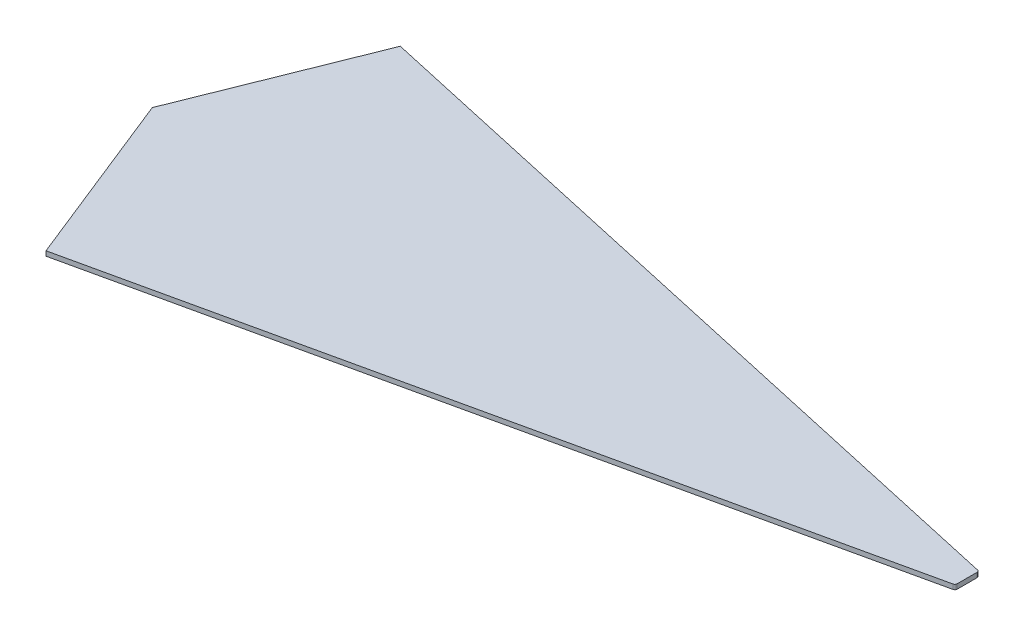
ISO-10303-21;
HEADER;
FILE_DESCRIPTION(('STEP AP214'),'2;1');
FILE_NAME('part.step','',(''),(''),'','','');
FILE_SCHEMA(('AUTOMOTIVE_DESIGN { 1 0 10303 214 1 1 1 1 }'));
ENDSEC;
DATA;
#1=APPLICATION_CONTEXT('core data for automotive mechanical design processes');
#2=APPLICATION_PROTOCOL_DEFINITION('international standard','automotive_design',2000,#1);
#3=PRODUCT_CONTEXT('',#1,'mechanical');
#4=PRODUCT('Part','Part','',(#3));
#5=PRODUCT_RELATED_PRODUCT_CATEGORY('part','',(#4));
#6=PRODUCT_DEFINITION_FORMATION('','',#4);
#7=PRODUCT_DEFINITION_CONTEXT('part definition',#1,'design');
#8=PRODUCT_DEFINITION('design','',#6,#7);
#9=PRODUCT_DEFINITION_SHAPE('','',#8);
#10=(LENGTH_UNIT() NAMED_UNIT(*) SI_UNIT(.MILLI.,.METRE.));
#11=(NAMED_UNIT(*) PLANE_ANGLE_UNIT() SI_UNIT($,.RADIAN.));
#12=(NAMED_UNIT(*) SI_UNIT($,.STERADIAN.) SOLID_ANGLE_UNIT());
#13=UNCERTAINTY_MEASURE_WITH_UNIT(LENGTH_MEASURE(1.E-05),#10,'distance_accuracy_value','');
#14=(GEOMETRIC_REPRESENTATION_CONTEXT(3) GLOBAL_UNCERTAINTY_ASSIGNED_CONTEXT((#13)) GLOBAL_UNIT_ASSIGNED_CONTEXT((#10,
#11,#12)) REPRESENTATION_CONTEXT('',''));
#15=CARTESIAN_POINT('',(0.,0.,0.));
#16=DIRECTION('',(0.,0.,1.));
#17=DIRECTION('',(1.,0.,0.));
#18=AXIS2_PLACEMENT_3D('',#15,#16,#17);
#19=CARTESIAN_POINT('',(31.4,0.2,-0.419782839363801));
#20=DIRECTION('',(0.,1.,0.));
#21=DIRECTION('',(0.,0.,1.));
#22=AXIS2_PLACEMENT_3D('',#19,#20,#21);
#23=CYLINDRICAL_SURFACE('',#22,0.1);
#24=DIRECTION('',(0.,1.,0.));
#25=VECTOR('',#24,1.);
#26=CARTESIAN_POINT('',(31.5,0.2,-0.419782839363801));
#27=LINE('',#26,#25);
#28=CARTESIAN_POINT('',(31.5,0.,-0.419782839363802));
#29=VERTEX_POINT('',#28);
#30=CARTESIAN_POINT('',(31.5,0.2,-0.419782839363802));
#31=VERTEX_POINT('',#30);
#32=EDGE_CURVE('E128',#29,#31,#27,.T.);
#33=ORIENTED_EDGE('',*,*,#32,.F.);
#34=CARTESIAN_POINT('',(31.4,0.,-0.419782839363801));
#35=DIRECTION('',(0.,1.,0.));
#36=DIRECTION('',(0.,0.,1.));
#37=AXIS2_PLACEMENT_3D('',#34,#35,#36);
#38=CIRCLE('',#37,0.1);
#39=CARTESIAN_POINT('',(31.4216930457823,0.,-0.517401545382093));
#40=VERTEX_POINT('',#39);
#41=EDGE_CURVE('E40',#40,#29,#38,.F.);
#42=ORIENTED_EDGE('',*,*,#41,.F.);
#43=DIRECTION('',(0.,1.,0.));
#44=VECTOR('',#43,1.);
#45=CARTESIAN_POINT('',(31.4216930457823,0.2,-0.517401545382094));
#46=LINE('',#45,#44);
#47=CARTESIAN_POINT('',(31.4216930457823,0.2,-0.517401545382093));
#48=VERTEX_POINT('',#47);
#49=EDGE_CURVE('E131',#48,#40,#46,.F.);
#50=ORIENTED_EDGE('',*,*,#49,.F.);
#51=CARTESIAN_POINT('',(31.4,0.2,-0.419782839363801));
#52=DIRECTION('',(0.,1.,0.));
#53=DIRECTION('',(0.,0.,1.));
#54=AXIS2_PLACEMENT_3D('',#51,#52,#53);
#55=CIRCLE('',#54,0.1);
#56=EDGE_CURVE('E11',#31,#48,#55,.T.);
#57=ORIENTED_EDGE('',*,*,#56,.F.);
#58=EDGE_LOOP('',(#33,#42,#50,#57));
#59=FACE_BOUND('',#58,.T.);
#60=ADVANCED_FACE('F33',(#59),#23,.T.);
#61=CARTESIAN_POINT('',(31.4,0.2,0.419782839363802));
#62=DIRECTION('',(0.,-1.,0.));
#63=DIRECTION('',(0.,0.,-1.));
#64=AXIS2_PLACEMENT_3D('',#61,#62,#63);
#65=CYLINDRICAL_SURFACE('',#64,0.1);
#66=DIRECTION('',(0.,1.,0.));
#67=VECTOR('',#66,1.);
#68=CARTESIAN_POINT('',(31.4216930457823,0.2,0.517401545382095));
#69=LINE('',#68,#67);
#70=CARTESIAN_POINT('',(31.4216930457823,0.,0.517401545382093));
#71=VERTEX_POINT('',#70);
#72=CARTESIAN_POINT('',(31.4216930457823,0.2,0.517401545382093));
#73=VERTEX_POINT('',#72);
#74=EDGE_CURVE('E98',#71,#73,#69,.T.);
#75=ORIENTED_EDGE('',*,*,#74,.F.);
#76=CARTESIAN_POINT('',(31.4,0.,0.419782839363802));
#77=DIRECTION('',(0.,1.,0.));
#78=DIRECTION('',(0.,0.,1.));
#79=AXIS2_PLACEMENT_3D('',#76,#77,#78);
#80=CIRCLE('',#79,0.1);
#81=CARTESIAN_POINT('',(31.5,0.,0.419782839363802));
#82=VERTEX_POINT('',#81);
#83=EDGE_CURVE('E124',#82,#71,#80,.F.);
#84=ORIENTED_EDGE('',*,*,#83,.F.);
#85=DIRECTION('',(0.,1.,0.));
#86=VECTOR('',#85,1.);
#87=CARTESIAN_POINT('',(31.5,0.2,0.419782839363802));
#88=LINE('',#87,#86);
#89=CARTESIAN_POINT('',(31.5,0.2,0.419782839363802));
#90=VERTEX_POINT('',#89);
#91=EDGE_CURVE('E116',#90,#82,#88,.F.);
#92=ORIENTED_EDGE('',*,*,#91,.F.);
#93=CARTESIAN_POINT('',(31.4,0.2,0.419782839363802));
#94=DIRECTION('',(0.,1.,0.));
#95=DIRECTION('',(0.,0.,1.));
#96=AXIS2_PLACEMENT_3D('',#93,#94,#95);
#97=CIRCLE('',#96,0.1);
#98=EDGE_CURVE('E126',#73,#90,#97,.T.);
#99=ORIENTED_EDGE('',*,*,#98,.F.);
#100=EDGE_LOOP('',(#75,#84,#92,#99));
#101=FACE_BOUND('',#100,.T.);
#102=ADVANCED_FACE('F157',(#101),#65,.T.);
#103=CARTESIAN_POINT('',(-3.,0.2,0.));
#104=DIRECTION('',(0.928476690855301,0.,-0.371390676429));
#105=DIRECTION('',(-0.371390676429,0.,-0.928476690855301));
#106=AXIS2_PLACEMENT_3D('',#103,#104,#105);
#107=PLANE('',#106);
#108=DIRECTION('',(0.371390676429,0.,0.928476690855301));
#109=VECTOR('',#108,1.);
#110=CARTESIAN_POINT('',(-3.,0.,0.));
#111=LINE('',#110,#109);
#112=CARTESIAN_POINT('',(-3.,0.,0.));
#113=VERTEX_POINT('',#112);
#114=CARTESIAN_POINT('',(7.01790739823793E-10,0.,7.5));
#115=VERTEX_POINT('',#114);
#116=EDGE_CURVE('E113',#113,#115,#111,.T.);
#117=ORIENTED_EDGE('',*,*,#116,.T.);
#118=DIRECTION('',(0.,-1.,0.));
#119=VECTOR('',#118,1.);
#120=CARTESIAN_POINT('',(7.01790739823793E-10,0.2,7.5));
#121=LINE('',#120,#119);
#122=CARTESIAN_POINT('',(7.01790739823793E-10,0.2,7.5));
#123=VERTEX_POINT('',#122);
#124=EDGE_CURVE('E95',#123,#115,#121,.T.);
#125=ORIENTED_EDGE('',*,*,#124,.F.);
#126=DIRECTION('',(0.371390676429,0.,0.928476690855301));
#127=VECTOR('',#126,1.);
#128=CARTESIAN_POINT('',(-3.,0.2,0.));
#129=LINE('',#128,#127);
#130=CARTESIAN_POINT('',(-3.,0.2,0.));
#131=VERTEX_POINT('',#130);
#132=EDGE_CURVE('E101',#131,#123,#129,.T.);
#133=ORIENTED_EDGE('',*,*,#132,.F.);
#134=DIRECTION('',(0.,-1.,0.));
#135=VECTOR('',#134,1.);
#136=CARTESIAN_POINT('',(-3.,0.2,0.));
#137=LINE('',#136,#135);
#138=EDGE_CURVE('E118',#131,#113,#137,.T.);
#139=ORIENTED_EDGE('',*,*,#138,.T.);
#140=EDGE_LOOP('',(#117,#125,#133,#139));
#141=FACE_BOUND('',#140,.T.);
#142=ADVANCED_FACE('F111',(#141),#107,.F.);
#143=CARTESIAN_POINT('',(7.01790739823793E-10,0.2,7.5));
#144=DIRECTION('',(-0.216930457823262,0.,-0.976187060182929));
#145=DIRECTION('',(-0.976187060182929,0.,0.216930457823262));
#146=AXIS2_PLACEMENT_3D('',#143,#144,#145);
#147=PLANE('',#146);
#148=DIRECTION('',(0.976187060182929,0.,-0.216930457823262));
#149=VECTOR('',#148,1.);
#150=CARTESIAN_POINT('',(7.01790739823793E-10,0.,7.5));
#151=LINE('',#150,#149);
#152=EDGE_CURVE('E144',#115,#71,#151,.T.);
#153=ORIENTED_EDGE('',*,*,#152,.T.);
#154=ORIENTED_EDGE('',*,*,#74,.T.);
#155=DIRECTION('',(0.976187060182929,0.,-0.216930457823262));
#156=VECTOR('',#155,1.);
#157=CARTESIAN_POINT('',(7.01790739823793E-10,0.2,7.5));
#158=LINE('',#157,#156);
#159=EDGE_CURVE('E90',#123,#73,#158,.T.);
#160=ORIENTED_EDGE('',*,*,#159,.F.);
#161=ORIENTED_EDGE('',*,*,#124,.T.);
#162=EDGE_LOOP('',(#153,#154,#160,#161));
#163=FACE_BOUND('',#162,.T.);
#164=ADVANCED_FACE('F93',(#163),#147,.F.);
#165=CARTESIAN_POINT('',(31.5,0.2,-0.5));
#166=DIRECTION('',(1.,0.,0.));
#167=DIRECTION('',(0.,0.,-1.));
#168=AXIS2_PLACEMENT_3D('',#165,#166,#167);
#169=PLANE('',#168);
#170=DIRECTION('',(0.,0.,1.));
#171=VECTOR('',#170,1.);
#172=CARTESIAN_POINT('',(31.5,0.,-0.5));
#173=LINE('',#172,#171);
#174=EDGE_CURVE('E136',#29,#82,#173,.T.);
#175=ORIENTED_EDGE('',*,*,#174,.F.);
#176=ORIENTED_EDGE('',*,*,#32,.T.);
#177=DIRECTION('',(0.,0.,1.));
#178=VECTOR('',#177,1.);
#179=CARTESIAN_POINT('',(31.5,0.2,-0.5));
#180=LINE('',#179,#178);
#181=EDGE_CURVE('E100',#31,#90,#180,.T.);
#182=ORIENTED_EDGE('',*,*,#181,.T.);
#183=ORIENTED_EDGE('',*,*,#91,.T.);
#184=EDGE_LOOP('',(#175,#176,#182,#183));
#185=FACE_BOUND('',#184,.T.);
#186=ADVANCED_FACE('F142',(#185),#169,.T.);
#187=CARTESIAN_POINT('',(7.01786147398297E-10,0.2,-7.5));
#188=DIRECTION('',(0.216930457823262,0.,-0.976187060182929));
#189=DIRECTION('',(-0.976187060182929,0.,-0.216930457823262));
#190=AXIS2_PLACEMENT_3D('',#187,#188,#189);
#191=PLANE('',#190);
#192=DIRECTION('',(0.976187060182929,0.,0.216930457823262));
#193=VECTOR('',#192,1.);
#194=CARTESIAN_POINT('',(7.01786147398297E-10,0.2,-7.5));
#195=LINE('',#194,#193);
#196=CARTESIAN_POINT('',(7.01786147398297E-10,0.2,-7.5));
#197=VERTEX_POINT('',#196);
#198=EDGE_CURVE('E150',#197,#48,#195,.T.);
#199=ORIENTED_EDGE('',*,*,#198,.T.);
#200=ORIENTED_EDGE('',*,*,#49,.T.);
#201=DIRECTION('',(0.976187060182929,0.,0.216930457823262));
#202=VECTOR('',#201,1.);
#203=CARTESIAN_POINT('',(7.01786147398297E-10,0.,-7.5));
#204=LINE('',#203,#202);
#205=CARTESIAN_POINT('',(7.01786147398297E-10,0.,-7.5));
#206=VERTEX_POINT('',#205);
#207=EDGE_CURVE('E140',#206,#40,#204,.T.);
#208=ORIENTED_EDGE('',*,*,#207,.F.);
#209=DIRECTION('',(0.,-1.,0.));
#210=VECTOR('',#209,1.);
#211=CARTESIAN_POINT('',(7.01786147398297E-10,0.2,-7.5));
#212=LINE('',#211,#210);
#213=EDGE_CURVE('E114',#197,#206,#212,.T.);
#214=ORIENTED_EDGE('',*,*,#213,.F.);
#215=EDGE_LOOP('',(#199,#200,#208,#214));
#216=FACE_BOUND('',#215,.T.);
#217=ADVANCED_FACE('F161',(#216),#191,.T.);
#218=CARTESIAN_POINT('',(-3.,0.2,0.));
#219=DIRECTION('',(-0.928476690855301,0.,-0.371390676428999));
#220=DIRECTION('',(-0.371390676428999,0.,0.928476690855301));
#221=AXIS2_PLACEMENT_3D('',#218,#219,#220);
#222=PLANE('',#221);
#223=DIRECTION('',(0.371390676428999,0.,-0.928476690855301));
#224=VECTOR('',#223,1.);
#225=CARTESIAN_POINT('',(-3.,0.,0.));
#226=LINE('',#225,#224);
#227=EDGE_CURVE('E109',#113,#206,#226,.T.);
#228=ORIENTED_EDGE('',*,*,#227,.F.);
#229=ORIENTED_EDGE('',*,*,#138,.F.);
#230=DIRECTION('',(0.371390676428999,0.,-0.928476690855301));
#231=VECTOR('',#230,1.);
#232=CARTESIAN_POINT('',(-3.,0.2,0.));
#233=LINE('',#232,#231);
#234=EDGE_CURVE('E107',#131,#197,#233,.T.);
#235=ORIENTED_EDGE('',*,*,#234,.T.);
#236=ORIENTED_EDGE('',*,*,#213,.T.);
#237=EDGE_LOOP('',(#228,#229,#235,#236));
#238=FACE_BOUND('',#237,.T.);
#239=ADVANCED_FACE('F159',(#238),#222,.T.);
#240=CARTESIAN_POINT('',(0.,0.2,0.));
#241=DIRECTION('',(0.,1.,0.));
#242=DIRECTION('',(0.,0.,1.));
#243=AXIS2_PLACEMENT_3D('',#240,#241,#242);
#244=PLANE('',#243);
#245=ORIENTED_EDGE('',*,*,#181,.F.);
#246=ORIENTED_EDGE('',*,*,#56,.T.);
#247=ORIENTED_EDGE('',*,*,#198,.F.);
#248=ORIENTED_EDGE('',*,*,#234,.F.);
#249=ORIENTED_EDGE('',*,*,#132,.T.);
#250=ORIENTED_EDGE('',*,*,#159,.T.);
#251=ORIENTED_EDGE('',*,*,#98,.T.);
#252=EDGE_LOOP('',(#245,#246,#247,#248,#249,#250,#251));
#253=FACE_BOUND('',#252,.T.);
#254=ADVANCED_FACE('F105',(#253),#244,.T.);
#255=CARTESIAN_POINT('',(0.,0.,0.));
#256=DIRECTION('',(0.,1.,0.));
#257=DIRECTION('',(0.,0.,1.));
#258=AXIS2_PLACEMENT_3D('',#255,#256,#257);
#259=PLANE('',#258);
#260=ORIENTED_EDGE('',*,*,#207,.T.);
#261=ORIENTED_EDGE('',*,*,#41,.T.);
#262=ORIENTED_EDGE('',*,*,#174,.T.);
#263=ORIENTED_EDGE('',*,*,#83,.T.);
#264=ORIENTED_EDGE('',*,*,#152,.F.);
#265=ORIENTED_EDGE('',*,*,#116,.F.);
#266=ORIENTED_EDGE('',*,*,#227,.T.);
#267=EDGE_LOOP('',(#260,#261,#262,#263,#264,#265,#266));
#268=FACE_BOUND('',#267,.T.);
#269=ADVANCED_FACE('F134',(#268),#259,.F.);
#270=CLOSED_SHELL('',(#60,#102,#142,#164,#186,#217,#239,#254,#269));
#271=MANIFOLD_SOLID_BREP('B2',#270);
#272=ADVANCED_BREP_SHAPE_REPRESENTATION('',(#18,#271),#14);
#273=SHAPE_DEFINITION_REPRESENTATION(#9,#272);
ENDSEC;
END-ISO-10303-21;
